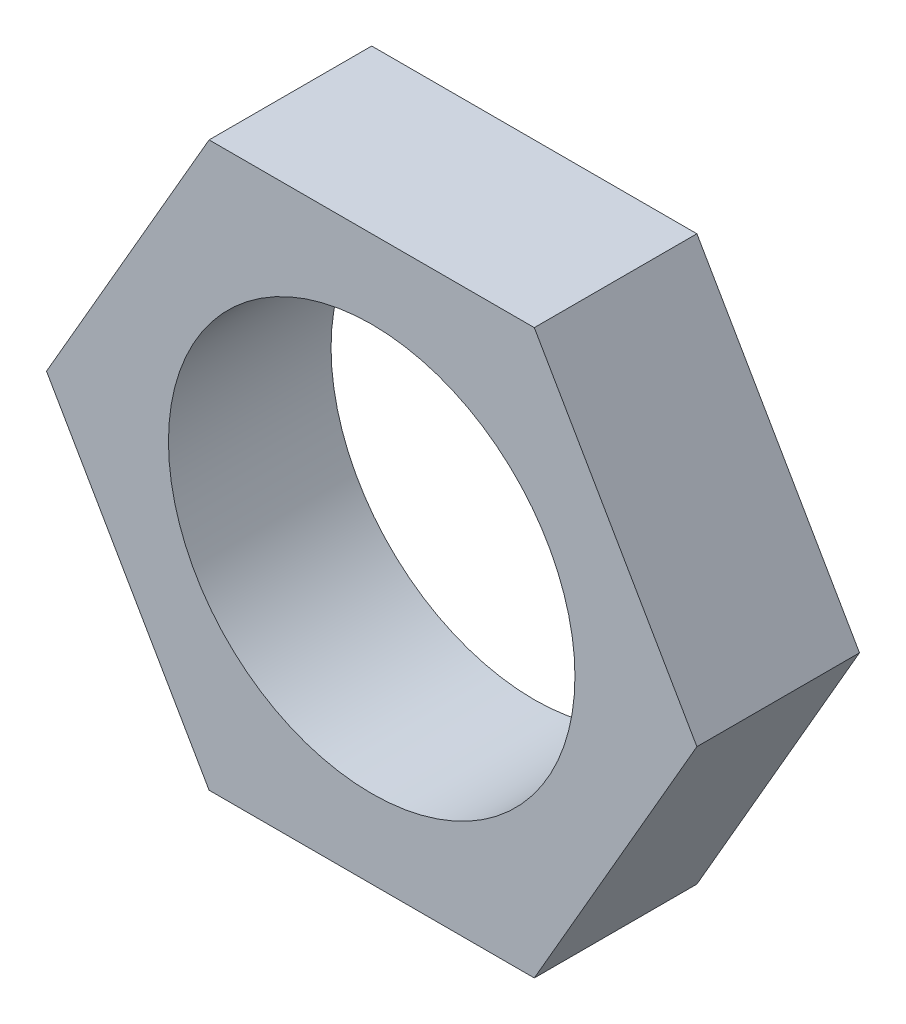
ISO-10303-21;
HEADER;
FILE_DESCRIPTION(('STEP AP214'),'2;1');
FILE_NAME('part.step','',(''),(''),'','','');
FILE_SCHEMA(('AUTOMOTIVE_DESIGN { 1 0 10303 214 1 1 1 1 }'));
ENDSEC;
DATA;
#1=APPLICATION_CONTEXT('core data for automotive mechanical design processes');
#2=APPLICATION_PROTOCOL_DEFINITION('international standard','automotive_design',2000,#1);
#3=PRODUCT_CONTEXT('',#1,'mechanical');
#4=PRODUCT('Part','Part','',(#3));
#5=PRODUCT_RELATED_PRODUCT_CATEGORY('part','',(#4));
#6=PRODUCT_DEFINITION_FORMATION('','',#4);
#7=PRODUCT_DEFINITION_CONTEXT('part definition',#1,'design');
#8=PRODUCT_DEFINITION('design','',#6,#7);
#9=PRODUCT_DEFINITION_SHAPE('','',#8);
#10=(LENGTH_UNIT() NAMED_UNIT(*) SI_UNIT(.MILLI.,.METRE.));
#11=(NAMED_UNIT(*) PLANE_ANGLE_UNIT() SI_UNIT($,.RADIAN.));
#12=(NAMED_UNIT(*) SI_UNIT($,.STERADIAN.) SOLID_ANGLE_UNIT());
#13=UNCERTAINTY_MEASURE_WITH_UNIT(LENGTH_MEASURE(1.E-05),#10,'distance_accuracy_value','');
#14=(GEOMETRIC_REPRESENTATION_CONTEXT(3) GLOBAL_UNCERTAINTY_ASSIGNED_CONTEXT((#13)) GLOBAL_UNIT_ASSIGNED_CONTEXT((#10,
#11,#12)) REPRESENTATION_CONTEXT('',''));
#15=CARTESIAN_POINT('',(0.,0.,0.));
#16=DIRECTION('',(0.,0.,1.));
#17=DIRECTION('',(1.,0.,0.));
#18=AXIS2_PLACEMENT_3D('',#15,#16,#17);
#19=CARTESIAN_POINT('',(3.81,-2.19970452561248,2.54));
#20=DIRECTION('',(-0.866025403784438,0.5,0.));
#21=DIRECTION('',(-0.5,-0.866025403784439,0.));
#22=AXIS2_PLACEMENT_3D('',#19,#20,#21);
#23=PLANE('',#22);
#24=DIRECTION('',(0.5,0.866025403784439,0.));
#25=VECTOR('',#24,1.);
#26=CARTESIAN_POINT('',(3.81,-2.19970452561248,0.));
#27=LINE('',#26,#25);
#28=CARTESIAN_POINT('',(2.54,-4.39940905122495,0.));
#29=VERTEX_POINT('',#28);
#30=CARTESIAN_POINT('',(5.08,0.,0.));
#31=VERTEX_POINT('',#30);
#32=EDGE_CURVE('E133',#29,#31,#27,.T.);
#33=ORIENTED_EDGE('',*,*,#32,.T.);
#34=DIRECTION('',(0.,0.,-1.));
#35=VECTOR('',#34,1.);
#36=CARTESIAN_POINT('',(5.08,0.,2.54));
#37=LINE('',#36,#35);
#38=CARTESIAN_POINT('',(5.08,0.,2.54));
#39=VERTEX_POINT('',#38);
#40=EDGE_CURVE('E11',#39,#31,#37,.T.);
#41=ORIENTED_EDGE('',*,*,#40,.F.);
#42=DIRECTION('',(0.5,0.866025403784439,0.));
#43=VECTOR('',#42,1.);
#44=CARTESIAN_POINT('',(3.81,-2.19970452561248,2.54));
#45=LINE('',#44,#43);
#46=CARTESIAN_POINT('',(2.54,-4.39940905122495,2.54));
#47=VERTEX_POINT('',#46);
#48=EDGE_CURVE('E166',#47,#39,#45,.T.);
#49=ORIENTED_EDGE('',*,*,#48,.F.);
#50=DIRECTION('',(0.,0.,-1.));
#51=VECTOR('',#50,1.);
#52=CARTESIAN_POINT('',(2.54,-4.39940905122495,2.54));
#53=LINE('',#52,#51);
#54=EDGE_CURVE('E125',#47,#29,#53,.T.);
#55=ORIENTED_EDGE('',*,*,#54,.T.);
#56=EDGE_LOOP('',(#33,#41,#49,#55));
#57=FACE_BOUND('',#56,.T.);
#58=ADVANCED_FACE('F39',(#57),#23,.F.);
#59=CARTESIAN_POINT('',(3.81,2.19970452561248,2.54));
#60=DIRECTION('',(-0.866025403784438,-0.5,0.));
#61=DIRECTION('',(0.5,-0.866025403784439,0.));
#62=AXIS2_PLACEMENT_3D('',#59,#60,#61);
#63=PLANE('',#62);
#64=DIRECTION('',(-0.5,0.866025403784439,0.));
#65=VECTOR('',#64,1.);
#66=CARTESIAN_POINT('',(3.81,2.19970452561248,0.));
#67=LINE('',#66,#65);
#68=CARTESIAN_POINT('',(2.54,4.39940905122495,0.));
#69=VERTEX_POINT('',#68);
#70=EDGE_CURVE('E137',#31,#69,#67,.T.);
#71=ORIENTED_EDGE('',*,*,#70,.T.);
#72=DIRECTION('',(0.,0.,-1.));
#73=VECTOR('',#72,1.);
#74=CARTESIAN_POINT('',(2.54,4.39940905122495,2.54));
#75=LINE('',#74,#73);
#76=CARTESIAN_POINT('',(2.54,4.39940905122495,2.54));
#77=VERTEX_POINT('',#76);
#78=EDGE_CURVE('E49',#77,#69,#75,.T.);
#79=ORIENTED_EDGE('',*,*,#78,.F.);
#80=DIRECTION('',(-0.5,0.866025403784439,0.));
#81=VECTOR('',#80,1.);
#82=CARTESIAN_POINT('',(3.81,2.19970452561248,2.54));
#83=LINE('',#82,#81);
#84=EDGE_CURVE('E94',#39,#77,#83,.T.);
#85=ORIENTED_EDGE('',*,*,#84,.F.);
#86=ORIENTED_EDGE('',*,*,#40,.T.);
#87=EDGE_LOOP('',(#71,#79,#85,#86));
#88=FACE_BOUND('',#87,.T.);
#89=ADVANCED_FACE('F180',(#88),#63,.F.);
#90=CARTESIAN_POINT('',(0.,4.39940905122495,2.54));
#91=DIRECTION('',(0.,-1.,0.));
#92=DIRECTION('',(0.,0.,-1.));
#93=AXIS2_PLACEMENT_3D('',#90,#91,#92);
#94=PLANE('',#93);
#95=DIRECTION('',(-1.,0.,0.));
#96=VECTOR('',#95,1.);
#97=CARTESIAN_POINT('',(0.,4.39940905122495,0.));
#98=LINE('',#97,#96);
#99=CARTESIAN_POINT('',(-2.54,4.39940905122495,0.));
#100=VERTEX_POINT('',#99);
#101=EDGE_CURVE('E140',#69,#100,#98,.T.);
#102=ORIENTED_EDGE('',*,*,#101,.T.);
#103=DIRECTION('',(0.,0.,-1.));
#104=VECTOR('',#103,1.);
#105=CARTESIAN_POINT('',(-2.54,4.39940905122495,2.54));
#106=LINE('',#105,#104);
#107=CARTESIAN_POINT('',(-2.54,4.39940905122495,2.54));
#108=VERTEX_POINT('',#107);
#109=EDGE_CURVE('E118',#108,#100,#106,.T.);
#110=ORIENTED_EDGE('',*,*,#109,.F.);
#111=DIRECTION('',(-1.,0.,0.));
#112=VECTOR('',#111,1.);
#113=CARTESIAN_POINT('',(0.,4.39940905122495,2.54));
#114=LINE('',#113,#112);
#115=EDGE_CURVE('E107',#77,#108,#114,.T.);
#116=ORIENTED_EDGE('',*,*,#115,.F.);
#117=ORIENTED_EDGE('',*,*,#78,.T.);
#118=EDGE_LOOP('',(#102,#110,#116,#117));
#119=FACE_BOUND('',#118,.T.);
#120=ADVANCED_FACE('F159',(#119),#94,.F.);
#121=CARTESIAN_POINT('',(-3.81,2.19970452561247,2.54));
#122=DIRECTION('',(0.866025403784439,-0.5,0.));
#123=DIRECTION('',(0.5,0.866025403784439,0.));
#124=AXIS2_PLACEMENT_3D('',#121,#122,#123);
#125=PLANE('',#124);
#126=DIRECTION('',(-0.5,-0.866025403784439,0.));
#127=VECTOR('',#126,1.);
#128=CARTESIAN_POINT('',(-3.81,2.19970452561247,0.));
#129=LINE('',#128,#127);
#130=CARTESIAN_POINT('',(-5.08,0.,0.));
#131=VERTEX_POINT('',#130);
#132=EDGE_CURVE('E116',#100,#131,#129,.T.);
#133=ORIENTED_EDGE('',*,*,#132,.T.);
#134=DIRECTION('',(0.,0.,-1.));
#135=VECTOR('',#134,1.);
#136=CARTESIAN_POINT('',(-5.08,0.,2.54));
#137=LINE('',#136,#135);
#138=CARTESIAN_POINT('',(-5.08,0.,2.54));
#139=VERTEX_POINT('',#138);
#140=EDGE_CURVE('E113',#139,#131,#137,.T.);
#141=ORIENTED_EDGE('',*,*,#140,.F.);
#142=DIRECTION('',(-0.5,-0.866025403784439,0.));
#143=VECTOR('',#142,1.);
#144=CARTESIAN_POINT('',(-3.81,2.19970452561247,2.54));
#145=LINE('',#144,#143);
#146=EDGE_CURVE('E101',#108,#139,#145,.T.);
#147=ORIENTED_EDGE('',*,*,#146,.F.);
#148=ORIENTED_EDGE('',*,*,#109,.T.);
#149=EDGE_LOOP('',(#133,#141,#147,#148));
#150=FACE_BOUND('',#149,.T.);
#151=ADVANCED_FACE('F114',(#150),#125,.F.);
#152=CARTESIAN_POINT('',(-3.81,-2.19970452561247,2.54));
#153=DIRECTION('',(0.866025403784439,0.5,0.));
#154=DIRECTION('',(-0.5,0.866025403784439,0.));
#155=AXIS2_PLACEMENT_3D('',#152,#153,#154);
#156=PLANE('',#155);
#157=DIRECTION('',(0.5,-0.866025403784439,0.));
#158=VECTOR('',#157,1.);
#159=CARTESIAN_POINT('',(-3.81,-2.19970452561247,0.));
#160=LINE('',#159,#158);
#161=CARTESIAN_POINT('',(-2.54,-4.39940905122495,0.));
#162=VERTEX_POINT('',#161);
#163=EDGE_CURVE('E80',#131,#162,#160,.T.);
#164=ORIENTED_EDGE('',*,*,#163,.T.);
#165=DIRECTION('',(0.,0.,-1.));
#166=VECTOR('',#165,1.);
#167=CARTESIAN_POINT('',(-2.54,-4.39940905122495,2.54));
#168=LINE('',#167,#166);
#169=CARTESIAN_POINT('',(-2.54,-4.39940905122495,2.54));
#170=VERTEX_POINT('',#169);
#171=EDGE_CURVE('E119',#170,#162,#168,.T.);
#172=ORIENTED_EDGE('',*,*,#171,.F.);
#173=DIRECTION('',(0.5,-0.866025403784439,0.));
#174=VECTOR('',#173,1.);
#175=CARTESIAN_POINT('',(-3.81,-2.19970452561247,2.54));
#176=LINE('',#175,#174);
#177=EDGE_CURVE('E105',#139,#170,#176,.T.);
#178=ORIENTED_EDGE('',*,*,#177,.F.);
#179=ORIENTED_EDGE('',*,*,#140,.T.);
#180=EDGE_LOOP('',(#164,#172,#178,#179));
#181=FACE_BOUND('',#180,.T.);
#182=ADVANCED_FACE('F121',(#181),#156,.F.);
#183=CARTESIAN_POINT('',(0.,0.,2.54));
#184=DIRECTION('',(0.,0.,-1.));
#185=DIRECTION('',(-1.,0.,0.));
#186=AXIS2_PLACEMENT_3D('',#183,#184,#185);
#187=CYLINDRICAL_SURFACE('',#186,3.175);
#188=CARTESIAN_POINT('',(0.,0.,2.54));
#189=DIRECTION('',(0.,0.,1.));
#190=DIRECTION('',(1.,0.,0.));
#191=AXIS2_PLACEMENT_3D('',#188,#189,#190);
#192=CIRCLE('',#191,3.175);
#193=CARTESIAN_POINT('',(3.175,0.,2.54));
#194=VERTEX_POINT('',#193);
#195=EDGE_CURVE('E149',#194,#194,#192,.T.);
#196=ORIENTED_EDGE('',*,*,#195,.T.);
#197=EDGE_LOOP('',(#196));
#198=FACE_BOUND('',#197,.T.);
#199=CARTESIAN_POINT('',(0.,0.,0.));
#200=DIRECTION('',(0.,0.,1.));
#201=DIRECTION('',(1.,0.,0.));
#202=AXIS2_PLACEMENT_3D('',#199,#200,#201);
#203=CIRCLE('',#202,3.175);
#204=CARTESIAN_POINT('',(3.175,0.,0.));
#205=VERTEX_POINT('',#204);
#206=EDGE_CURVE('E129',#205,#205,#203,.T.);
#207=ORIENTED_EDGE('',*,*,#206,.F.);
#208=EDGE_LOOP('',(#207));
#209=FACE_BOUND('',#208,.T.);
#210=ADVANCED_FACE('F41',(#198,#209),#187,.F.);
#211=CARTESIAN_POINT('',(0.,-4.39940905122495,2.54));
#212=DIRECTION('',(0.,1.,0.));
#213=DIRECTION('',(0.,0.,1.));
#214=AXIS2_PLACEMENT_3D('',#211,#212,#213);
#215=PLANE('',#214);
#216=DIRECTION('',(1.,0.,0.));
#217=VECTOR('',#216,1.);
#218=CARTESIAN_POINT('',(0.,-4.39940905122495,0.));
#219=LINE('',#218,#217);
#220=EDGE_CURVE('E86',#162,#29,#219,.T.);
#221=ORIENTED_EDGE('',*,*,#220,.T.);
#222=ORIENTED_EDGE('',*,*,#54,.F.);
#223=DIRECTION('',(1.,0.,0.));
#224=VECTOR('',#223,1.);
#225=CARTESIAN_POINT('',(0.,-4.39940905122495,2.54));
#226=LINE('',#225,#224);
#227=EDGE_CURVE('E57',#170,#47,#226,.T.);
#228=ORIENTED_EDGE('',*,*,#227,.F.);
#229=ORIENTED_EDGE('',*,*,#171,.T.);
#230=EDGE_LOOP('',(#221,#222,#228,#229));
#231=FACE_BOUND('',#230,.T.);
#232=ADVANCED_FACE('F167',(#231),#215,.F.);
#233=CARTESIAN_POINT('',(0.,0.,2.54));
#234=DIRECTION('',(0.,0.,1.));
#235=DIRECTION('',(1.,0.,0.));
#236=AXIS2_PLACEMENT_3D('',#233,#234,#235);
#237=PLANE('',#236);
#238=ORIENTED_EDGE('',*,*,#195,.F.);
#239=EDGE_LOOP('',(#238));
#240=FACE_BOUND('',#239,.T.);
#241=ORIENTED_EDGE('',*,*,#48,.T.);
#242=ORIENTED_EDGE('',*,*,#84,.T.);
#243=ORIENTED_EDGE('',*,*,#115,.T.);
#244=ORIENTED_EDGE('',*,*,#146,.T.);
#245=ORIENTED_EDGE('',*,*,#177,.T.);
#246=ORIENTED_EDGE('',*,*,#227,.T.);
#247=EDGE_LOOP('',(#241,#242,#243,#244,#245,#246));
#248=FACE_BOUND('',#247,.T.);
#249=ADVANCED_FACE('F103',(#240,#248),#237,.T.);
#250=CARTESIAN_POINT('',(0.,0.,0.));
#251=DIRECTION('',(0.,0.,1.));
#252=DIRECTION('',(1.,0.,0.));
#253=AXIS2_PLACEMENT_3D('',#250,#251,#252);
#254=PLANE('',#253);
#255=ORIENTED_EDGE('',*,*,#206,.T.);
#256=EDGE_LOOP('',(#255));
#257=FACE_BOUND('',#256,.T.);
#258=ORIENTED_EDGE('',*,*,#32,.F.);
#259=ORIENTED_EDGE('',*,*,#220,.F.);
#260=ORIENTED_EDGE('',*,*,#163,.F.);
#261=ORIENTED_EDGE('',*,*,#132,.F.);
#262=ORIENTED_EDGE('',*,*,#101,.F.);
#263=ORIENTED_EDGE('',*,*,#70,.F.);
#264=EDGE_LOOP('',(#258,#259,#260,#261,#262,#263));
#265=FACE_BOUND('',#264,.T.);
#266=ADVANCED_FACE('F162',(#257,#265),#254,.F.);
#267=CLOSED_SHELL('',(#58,#89,#120,#151,#182,#210,#232,#249,#266));
#268=MANIFOLD_SOLID_BREP('B2',#267);
#269=ADVANCED_BREP_SHAPE_REPRESENTATION('',(#18,#268),#14);
#270=SHAPE_DEFINITION_REPRESENTATION(#9,#269);
ENDSEC;
END-ISO-10303-21;
